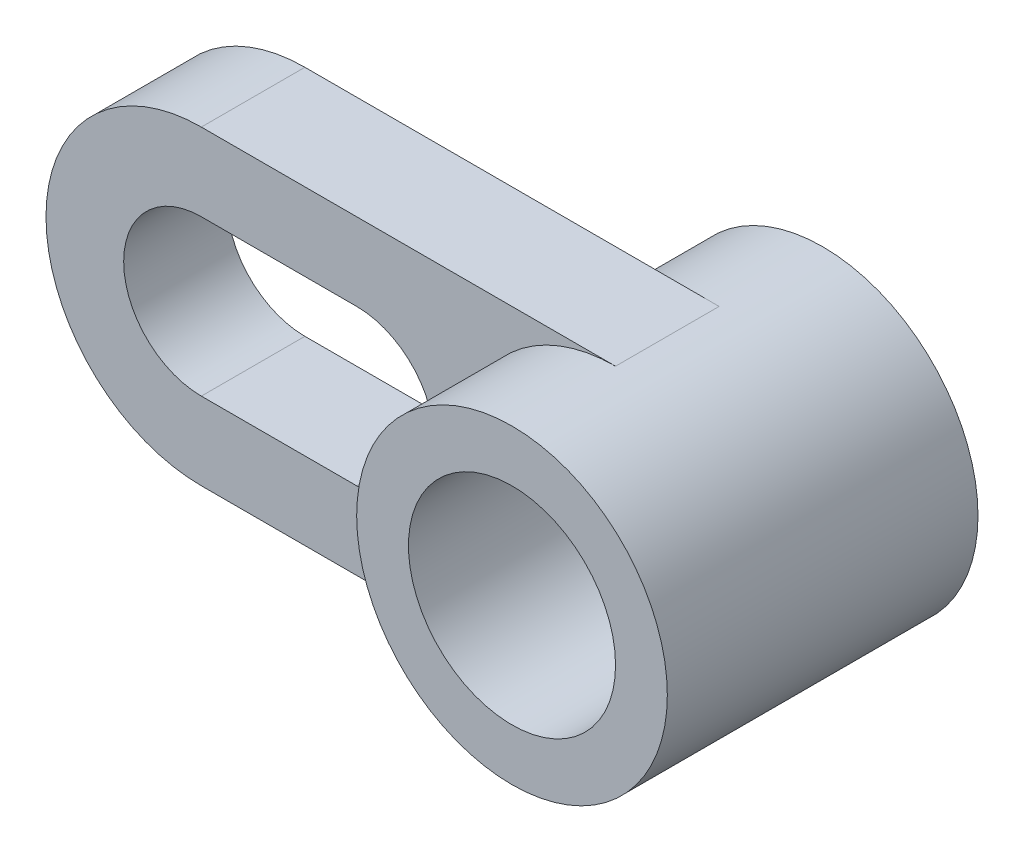
ISO-10303-21;
HEADER;
FILE_DESCRIPTION(('STEP AP214'),'2;1');
FILE_NAME('part.step','',(''),(''),'','','');
FILE_SCHEMA(('AUTOMOTIVE_DESIGN { 1 0 10303 214 1 1 1 1 }'));
ENDSEC;
DATA;
#1=APPLICATION_CONTEXT('core data for automotive mechanical design processes');
#2=APPLICATION_PROTOCOL_DEFINITION('international standard','automotive_design',2000,#1);
#3=PRODUCT_CONTEXT('',#1,'mechanical');
#4=PRODUCT('Part','Part','',(#3));
#5=PRODUCT_RELATED_PRODUCT_CATEGORY('part','',(#4));
#6=PRODUCT_DEFINITION_FORMATION('','',#4);
#7=PRODUCT_DEFINITION_CONTEXT('part definition',#1,'design');
#8=PRODUCT_DEFINITION('design','',#6,#7);
#9=PRODUCT_DEFINITION_SHAPE('','',#8);
#10=(LENGTH_UNIT() NAMED_UNIT(*) SI_UNIT(.MILLI.,.METRE.));
#11=(NAMED_UNIT(*) PLANE_ANGLE_UNIT() SI_UNIT($,.RADIAN.));
#12=(NAMED_UNIT(*) SI_UNIT($,.STERADIAN.) SOLID_ANGLE_UNIT());
#13=UNCERTAINTY_MEASURE_WITH_UNIT(LENGTH_MEASURE(1.E-05),#10,'distance_accuracy_value','');
#14=(GEOMETRIC_REPRESENTATION_CONTEXT(3) GLOBAL_UNCERTAINTY_ASSIGNED_CONTEXT((#13)) GLOBAL_UNIT_ASSIGNED_CONTEXT((#10,
#11,#12)) REPRESENTATION_CONTEXT('',''));
#15=CARTESIAN_POINT('',(0.,0.,0.));
#16=DIRECTION('',(0.,0.,1.));
#17=DIRECTION('',(1.,0.,0.));
#18=AXIS2_PLACEMENT_3D('',#15,#16,#17);
#19=CARTESIAN_POINT('',(0.,0.,-30.));
#20=DIRECTION('',(0.,0.,1.));
#21=DIRECTION('',(1.,0.,0.));
#22=AXIS2_PLACEMENT_3D('',#19,#20,#21);
#23=CYLINDRICAL_SURFACE('',#22,15.);
#24=CARTESIAN_POINT('',(0.,0.,-30.));
#25=DIRECTION('',(0.,0.,1.));
#26=DIRECTION('',(1.,0.,0.));
#27=AXIS2_PLACEMENT_3D('',#24,#25,#26);
#28=CIRCLE('',#27,15.);
#29=CARTESIAN_POINT('',(15.,0.,-30.));
#30=VERTEX_POINT('',#29);
#31=EDGE_CURVE('E11',#30,#30,#28,.T.);
#32=ORIENTED_EDGE('',*,*,#31,.T.);
#33=EDGE_LOOP('',(#32));
#34=FACE_BOUND('',#33,.T.);
#35=CARTESIAN_POINT('',(0.,0.,0.));
#36=DIRECTION('',(0.,0.,1.));
#37=DIRECTION('',(1.,0.,0.));
#38=AXIS2_PLACEMENT_3D('',#35,#36,#37);
#39=CIRCLE('',#38,15.);
#40=CARTESIAN_POINT('',(15.,0.,0.));
#41=VERTEX_POINT('',#40);
#42=EDGE_CURVE('E40',#41,#41,#39,.T.);
#43=ORIENTED_EDGE('',*,*,#42,.F.);
#44=EDGE_LOOP('',(#43));
#45=FACE_BOUND('',#44,.T.);
#46=CARTESIAN_POINT('',(0.,0.,-10.));
#47=DIRECTION('',(0.,0.,-1.));
#48=DIRECTION('',(1.,0.,0.));
#49=AXIS2_PLACEMENT_3D('',#46,#47,#48);
#50=CIRCLE('',#49,15.);
#51=CARTESIAN_POINT('',(0.,-15.,-10.));
#52=VERTEX_POINT('',#51);
#53=CARTESIAN_POINT('',(0.,15.,-10.));
#54=VERTEX_POINT('',#53);
#55=EDGE_CURVE('E51',#52,#54,#50,.T.);
#56=ORIENTED_EDGE('',*,*,#55,.F.);
#57=DIRECTION('',(0.,0.,-1.));
#58=VECTOR('',#57,1.);
#59=CARTESIAN_POINT('',(0.,-15.,-10.));
#60=LINE('',#59,#58);
#61=CARTESIAN_POINT('',(0.,-15.,-20.));
#62=VERTEX_POINT('',#61);
#63=EDGE_CURVE('E56',#52,#62,#60,.T.);
#64=ORIENTED_EDGE('',*,*,#63,.T.);
#65=CARTESIAN_POINT('',(0.,0.,-20.));
#66=DIRECTION('',(0.,0.,-1.));
#67=DIRECTION('',(1.,0.,0.));
#68=AXIS2_PLACEMENT_3D('',#65,#66,#67);
#69=CIRCLE('',#68,15.);
#70=CARTESIAN_POINT('',(0.,15.,-20.));
#71=VERTEX_POINT('',#70);
#72=EDGE_CURVE('E157',#62,#71,#69,.T.);
#73=ORIENTED_EDGE('',*,*,#72,.T.);
#74=DIRECTION('',(0.,0.,-1.));
#75=VECTOR('',#74,1.);
#76=CARTESIAN_POINT('',(0.,15.,-10.));
#77=LINE('',#76,#75);
#78=EDGE_CURVE('E162',#54,#71,#77,.T.);
#79=ORIENTED_EDGE('',*,*,#78,.F.);
#80=EDGE_LOOP('',(#56,#64,#73,#79));
#81=FACE_BOUND('',#80,.T.);
#82=ADVANCED_FACE('F37',(#34,#45,#81),#23,.T.);
#83=CARTESIAN_POINT('',(0.,0.,-30.));
#84=DIRECTION('',(0.,0.,1.));
#85=DIRECTION('',(1.,0.,0.));
#86=AXIS2_PLACEMENT_3D('',#83,#84,#85);
#87=PLANE('',#86);
#88=CARTESIAN_POINT('',(0.,0.,-30.));
#89=DIRECTION('',(0.,0.,1.));
#90=DIRECTION('',(1.,0.,0.));
#91=AXIS2_PLACEMENT_3D('',#88,#89,#90);
#92=CIRCLE('',#91,10.);
#93=CARTESIAN_POINT('',(10.,0.,-30.));
#94=VERTEX_POINT('',#93);
#95=EDGE_CURVE('E170',#94,#94,#92,.T.);
#96=ORIENTED_EDGE('',*,*,#95,.T.);
#97=EDGE_LOOP('',(#96));
#98=FACE_BOUND('',#97,.T.);
#99=ORIENTED_EDGE('',*,*,#31,.F.);
#100=EDGE_LOOP('',(#99));
#101=FACE_BOUND('',#100,.T.);
#102=ADVANCED_FACE('F181',(#98,#101),#87,.F.);
#103=CARTESIAN_POINT('',(0.,0.,0.));
#104=DIRECTION('',(0.,0.,1.));
#105=DIRECTION('',(1.,0.,0.));
#106=AXIS2_PLACEMENT_3D('',#103,#104,#105);
#107=PLANE('',#106);
#108=CARTESIAN_POINT('',(0.,0.,0.));
#109=DIRECTION('',(0.,0.,1.));
#110=DIRECTION('',(1.,0.,0.));
#111=AXIS2_PLACEMENT_3D('',#108,#109,#110);
#112=CIRCLE('',#111,10.);
#113=CARTESIAN_POINT('',(10.,0.,0.));
#114=VERTEX_POINT('',#113);
#115=EDGE_CURVE('E169',#114,#114,#112,.T.);
#116=ORIENTED_EDGE('',*,*,#115,.F.);
#117=EDGE_LOOP('',(#116));
#118=FACE_BOUND('',#117,.T.);
#119=ORIENTED_EDGE('',*,*,#42,.T.);
#120=EDGE_LOOP('',(#119));
#121=FACE_BOUND('',#120,.T.);
#122=ADVANCED_FACE('F178',(#118,#121),#107,.T.);
#123=CARTESIAN_POINT('',(0.,0.,-30.));
#124=DIRECTION('',(0.,0.,1.));
#125=DIRECTION('',(1.,0.,0.));
#126=AXIS2_PLACEMENT_3D('',#123,#124,#125);
#127=CYLINDRICAL_SURFACE('',#126,10.);
#128=ORIENTED_EDGE('',*,*,#95,.F.);
#129=EDGE_LOOP('',(#128));
#130=FACE_BOUND('',#129,.T.);
#131=ORIENTED_EDGE('',*,*,#115,.T.);
#132=EDGE_LOOP('',(#131));
#133=FACE_BOUND('',#132,.T.);
#134=ADVANCED_FACE('F176',(#130,#133),#127,.F.);
#135=CARTESIAN_POINT('',(-40.,0.,-10.));
#136=DIRECTION('',(0.,0.,1.));
#137=DIRECTION('',(1.,0.,0.));
#138=AXIS2_PLACEMENT_3D('',#135,#136,#137);
#139=PLANE('',#138);
#140=CARTESIAN_POINT('',(-40.,0.,-10.));
#141=DIRECTION('',(0.,0.,1.));
#142=DIRECTION('',(1.,0.,0.));
#143=AXIS2_PLACEMENT_3D('',#140,#141,#142);
#144=CIRCLE('',#143,15.);
#145=CARTESIAN_POINT('',(-40.,15.,-10.));
#146=VERTEX_POINT('',#145);
#147=CARTESIAN_POINT('',(-40.,-15.,-10.));
#148=VERTEX_POINT('',#147);
#149=EDGE_CURVE('E143',#146,#148,#144,.T.);
#150=ORIENTED_EDGE('',*,*,#149,.T.);
#151=DIRECTION('',(1.,0.,0.));
#152=VECTOR('',#151,1.);
#153=CARTESIAN_POINT('',(-40.,-15.,-10.));
#154=LINE('',#153,#152);
#155=EDGE_CURVE('E146',#148,#52,#154,.T.);
#156=ORIENTED_EDGE('',*,*,#155,.T.);
#157=ORIENTED_EDGE('',*,*,#55,.T.);
#158=DIRECTION('',(-1.,0.,0.));
#159=VECTOR('',#158,1.);
#160=CARTESIAN_POINT('',(-40.,15.,-10.));
#161=LINE('',#160,#159);
#162=EDGE_CURVE('E150',#54,#146,#161,.T.);
#163=ORIENTED_EDGE('',*,*,#162,.T.);
#164=EDGE_LOOP('',(#150,#156,#157,#163));
#165=FACE_BOUND('',#164,.T.);
#166=DIRECTION('',(1.,0.,0.));
#167=VECTOR('',#166,1.);
#168=CARTESIAN_POINT('',(-40.,-7.5,-10.));
#169=LINE('',#168,#167);
#170=CARTESIAN_POINT('',(-40.,-7.5,-10.));
#171=VERTEX_POINT('',#170);
#172=CARTESIAN_POINT('',(-25.,-7.5,-10.));
#173=VERTEX_POINT('',#172);
#174=EDGE_CURVE('E111',#171,#173,#169,.T.);
#175=ORIENTED_EDGE('',*,*,#174,.F.);
#176=CARTESIAN_POINT('',(-40.,0.,-10.));
#177=DIRECTION('',(0.,0.,1.));
#178=DIRECTION('',(1.,0.,0.));
#179=AXIS2_PLACEMENT_3D('',#176,#177,#178);
#180=CIRCLE('',#179,7.5);
#181=CARTESIAN_POINT('',(-40.,7.5,-10.));
#182=VERTEX_POINT('',#181);
#183=EDGE_CURVE('E101',#182,#171,#180,.T.);
#184=ORIENTED_EDGE('',*,*,#183,.F.);
#185=DIRECTION('',(-1.,0.,0.));
#186=VECTOR('',#185,1.);
#187=CARTESIAN_POINT('',(-40.,7.5,-10.));
#188=LINE('',#187,#186);
#189=CARTESIAN_POINT('',(-25.,7.5,-10.));
#190=VERTEX_POINT('',#189);
#191=EDGE_CURVE('E127',#190,#182,#188,.T.);
#192=ORIENTED_EDGE('',*,*,#191,.F.);
#193=CARTESIAN_POINT('',(-25.,0.,-10.));
#194=DIRECTION('',(0.,0.,1.));
#195=DIRECTION('',(1.,0.,0.));
#196=AXIS2_PLACEMENT_3D('',#193,#194,#195);
#197=CIRCLE('',#196,7.5);
#198=EDGE_CURVE('E125',#173,#190,#197,.T.);
#199=ORIENTED_EDGE('',*,*,#198,.F.);
#200=EDGE_LOOP('',(#175,#184,#192,#199));
#201=FACE_BOUND('',#200,.T.);
#202=ADVANCED_FACE('F123',(#165,#201),#139,.T.);
#203=CARTESIAN_POINT('',(-40.,0.,-20.));
#204=DIRECTION('',(0.,0.,1.));
#205=DIRECTION('',(1.,0.,0.));
#206=AXIS2_PLACEMENT_3D('',#203,#204,#205);
#207=PLANE('',#206);
#208=CARTESIAN_POINT('',(-40.,0.,-20.));
#209=DIRECTION('',(0.,0.,1.));
#210=DIRECTION('',(1.,0.,0.));
#211=AXIS2_PLACEMENT_3D('',#208,#209,#210);
#212=CIRCLE('',#211,15.);
#213=CARTESIAN_POINT('',(-40.,15.,-20.));
#214=VERTEX_POINT('',#213);
#215=CARTESIAN_POINT('',(-40.,-15.,-20.));
#216=VERTEX_POINT('',#215);
#217=EDGE_CURVE('E119',#214,#216,#212,.T.);
#218=ORIENTED_EDGE('',*,*,#217,.F.);
#219=DIRECTION('',(-1.,0.,0.));
#220=VECTOR('',#219,1.);
#221=CARTESIAN_POINT('',(-40.,15.,-20.));
#222=LINE('',#221,#220);
#223=EDGE_CURVE('E147',#71,#214,#222,.T.);
#224=ORIENTED_EDGE('',*,*,#223,.F.);
#225=ORIENTED_EDGE('',*,*,#72,.F.);
#226=DIRECTION('',(1.,0.,0.));
#227=VECTOR('',#226,1.);
#228=CARTESIAN_POINT('',(-40.,-15.,-20.));
#229=LINE('',#228,#227);
#230=EDGE_CURVE('E155',#216,#62,#229,.T.);
#231=ORIENTED_EDGE('',*,*,#230,.F.);
#232=EDGE_LOOP('',(#218,#224,#225,#231));
#233=FACE_BOUND('',#232,.T.);
#234=CARTESIAN_POINT('',(-40.,0.,-20.));
#235=DIRECTION('',(0.,0.,1.));
#236=DIRECTION('',(1.,0.,0.));
#237=AXIS2_PLACEMENT_3D('',#234,#235,#236);
#238=CIRCLE('',#237,7.5);
#239=CARTESIAN_POINT('',(-40.,7.5,-20.));
#240=VERTEX_POINT('',#239);
#241=CARTESIAN_POINT('',(-40.,-7.5,-20.));
#242=VERTEX_POINT('',#241);
#243=EDGE_CURVE('E131',#240,#242,#238,.T.);
#244=ORIENTED_EDGE('',*,*,#243,.T.);
#245=DIRECTION('',(1.,0.,0.));
#246=VECTOR('',#245,1.);
#247=CARTESIAN_POINT('',(-40.,-7.5,-20.));
#248=LINE('',#247,#246);
#249=CARTESIAN_POINT('',(-25.,-7.5,-20.));
#250=VERTEX_POINT('',#249);
#251=EDGE_CURVE('E118',#242,#250,#248,.T.);
#252=ORIENTED_EDGE('',*,*,#251,.T.);
#253=CARTESIAN_POINT('',(-25.,0.,-20.));
#254=DIRECTION('',(0.,0.,1.));
#255=DIRECTION('',(1.,0.,0.));
#256=AXIS2_PLACEMENT_3D('',#253,#254,#255);
#257=CIRCLE('',#256,7.5);
#258=CARTESIAN_POINT('',(-25.,7.5,-20.));
#259=VERTEX_POINT('',#258);
#260=EDGE_CURVE('E134',#250,#259,#257,.T.);
#261=ORIENTED_EDGE('',*,*,#260,.T.);
#262=DIRECTION('',(-1.,0.,0.));
#263=VECTOR('',#262,1.);
#264=CARTESIAN_POINT('',(-40.,7.5,-20.));
#265=LINE('',#264,#263);
#266=EDGE_CURVE('E112',#259,#240,#265,.T.);
#267=ORIENTED_EDGE('',*,*,#266,.T.);
#268=EDGE_LOOP('',(#244,#252,#261,#267));
#269=FACE_BOUND('',#268,.T.);
#270=ADVANCED_FACE('F204',(#233,#269),#207,.F.);
#271=CARTESIAN_POINT('',(-40.,0.,-10.));
#272=DIRECTION('',(0.,0.,-1.));
#273=DIRECTION('',(-1.,0.,0.));
#274=AXIS2_PLACEMENT_3D('',#271,#272,#273);
#275=CYLINDRICAL_SURFACE('',#274,15.);
#276=ORIENTED_EDGE('',*,*,#217,.T.);
#277=DIRECTION('',(0.,0.,-1.));
#278=VECTOR('',#277,1.);
#279=CARTESIAN_POINT('',(-40.,-15.,-10.));
#280=LINE('',#279,#278);
#281=EDGE_CURVE('E166',#148,#216,#280,.T.);
#282=ORIENTED_EDGE('',*,*,#281,.F.);
#283=ORIENTED_EDGE('',*,*,#149,.F.);
#284=DIRECTION('',(0.,0.,-1.));
#285=VECTOR('',#284,1.);
#286=CARTESIAN_POINT('',(-40.,15.,-10.));
#287=LINE('',#286,#285);
#288=EDGE_CURVE('E152',#146,#214,#287,.T.);
#289=ORIENTED_EDGE('',*,*,#288,.T.);
#290=EDGE_LOOP('',(#276,#282,#283,#289));
#291=FACE_BOUND('',#290,.T.);
#292=ADVANCED_FACE('F200',(#291),#275,.T.);
#293=CARTESIAN_POINT('',(-40.,-15.,-10.));
#294=DIRECTION('',(0.,1.,0.));
#295=DIRECTION('',(0.,0.,1.));
#296=AXIS2_PLACEMENT_3D('',#293,#294,#295);
#297=PLANE('',#296);
#298=ORIENTED_EDGE('',*,*,#230,.T.);
#299=ORIENTED_EDGE('',*,*,#63,.F.);
#300=ORIENTED_EDGE('',*,*,#155,.F.);
#301=ORIENTED_EDGE('',*,*,#281,.T.);
#302=EDGE_LOOP('',(#298,#299,#300,#301));
#303=FACE_BOUND('',#302,.T.);
#304=ADVANCED_FACE('F203',(#303),#297,.F.);
#305=CARTESIAN_POINT('',(-40.,15.,-10.));
#306=DIRECTION('',(0.,-1.,0.));
#307=DIRECTION('',(0.,0.,-1.));
#308=AXIS2_PLACEMENT_3D('',#305,#306,#307);
#309=PLANE('',#308);
#310=ORIENTED_EDGE('',*,*,#223,.T.);
#311=ORIENTED_EDGE('',*,*,#288,.F.);
#312=ORIENTED_EDGE('',*,*,#162,.F.);
#313=ORIENTED_EDGE('',*,*,#78,.T.);
#314=EDGE_LOOP('',(#310,#311,#312,#313));
#315=FACE_BOUND('',#314,.T.);
#316=ADVANCED_FACE('F208',(#315),#309,.F.);
#317=CARTESIAN_POINT('',(-40.,0.,-10.));
#318=DIRECTION('',(0.,0.,-1.));
#319=DIRECTION('',(-1.,0.,0.));
#320=AXIS2_PLACEMENT_3D('',#317,#318,#319);
#321=CYLINDRICAL_SURFACE('',#320,7.5);
#322=ORIENTED_EDGE('',*,*,#243,.F.);
#323=DIRECTION('',(0.,0.,-1.));
#324=VECTOR('',#323,1.);
#325=CARTESIAN_POINT('',(-40.,7.5,-10.));
#326=LINE('',#325,#324);
#327=EDGE_CURVE('E107',#182,#240,#326,.T.);
#328=ORIENTED_EDGE('',*,*,#327,.F.);
#329=ORIENTED_EDGE('',*,*,#183,.T.);
#330=DIRECTION('',(0.,0.,-1.));
#331=VECTOR('',#330,1.);
#332=CARTESIAN_POINT('',(-40.,-7.5,-10.));
#333=LINE('',#332,#331);
#334=EDGE_CURVE('E104',#171,#242,#333,.T.);
#335=ORIENTED_EDGE('',*,*,#334,.T.);
#336=EDGE_LOOP('',(#322,#328,#329,#335));
#337=FACE_BOUND('',#336,.T.);
#338=ADVANCED_FACE('F103',(#337),#321,.F.);
#339=CARTESIAN_POINT('',(-40.,-7.5,-10.));
#340=DIRECTION('',(0.,1.,0.));
#341=DIRECTION('',(0.,0.,1.));
#342=AXIS2_PLACEMENT_3D('',#339,#340,#341);
#343=PLANE('',#342);
#344=ORIENTED_EDGE('',*,*,#251,.F.);
#345=ORIENTED_EDGE('',*,*,#334,.F.);
#346=ORIENTED_EDGE('',*,*,#174,.T.);
#347=DIRECTION('',(0.,0.,-1.));
#348=VECTOR('',#347,1.);
#349=CARTESIAN_POINT('',(-25.,-7.5,-10.));
#350=LINE('',#349,#348);
#351=EDGE_CURVE('E120',#173,#250,#350,.T.);
#352=ORIENTED_EDGE('',*,*,#351,.T.);
#353=EDGE_LOOP('',(#344,#345,#346,#352));
#354=FACE_BOUND('',#353,.T.);
#355=ADVANCED_FACE('F115',(#354),#343,.T.);
#356=CARTESIAN_POINT('',(-25.,0.,-10.));
#357=DIRECTION('',(0.,0.,-1.));
#358=DIRECTION('',(-1.,0.,0.));
#359=AXIS2_PLACEMENT_3D('',#356,#357,#358);
#360=CYLINDRICAL_SURFACE('',#359,7.5);
#361=ORIENTED_EDGE('',*,*,#260,.F.);
#362=ORIENTED_EDGE('',*,*,#351,.F.);
#363=ORIENTED_EDGE('',*,*,#198,.T.);
#364=DIRECTION('',(0.,0.,-1.));
#365=VECTOR('',#364,1.);
#366=CARTESIAN_POINT('',(-25.,7.5,-10.));
#367=LINE('',#366,#365);
#368=EDGE_CURVE('E140',#190,#259,#367,.T.);
#369=ORIENTED_EDGE('',*,*,#368,.T.);
#370=EDGE_LOOP('',(#361,#362,#363,#369));
#371=FACE_BOUND('',#370,.T.);
#372=ADVANCED_FACE('F223',(#371),#360,.F.);
#373=CARTESIAN_POINT('',(-40.,7.5,-10.));
#374=DIRECTION('',(0.,-1.,0.));
#375=DIRECTION('',(0.,0.,-1.));
#376=AXIS2_PLACEMENT_3D('',#373,#374,#375);
#377=PLANE('',#376);
#378=ORIENTED_EDGE('',*,*,#266,.F.);
#379=ORIENTED_EDGE('',*,*,#368,.F.);
#380=ORIENTED_EDGE('',*,*,#191,.T.);
#381=ORIENTED_EDGE('',*,*,#327,.T.);
#382=EDGE_LOOP('',(#378,#379,#380,#381));
#383=FACE_BOUND('',#382,.T.);
#384=ADVANCED_FACE('F226',(#383),#377,.T.);
#385=CLOSED_SHELL('',(#82,#102,#122,#134,#202,#270,#292,#304,#316,#338,#355,#372,#384));
#386=MANIFOLD_SOLID_BREP('B2',#385);
#387=ADVANCED_BREP_SHAPE_REPRESENTATION('',(#18,#386),#14);
#388=SHAPE_DEFINITION_REPRESENTATION(#9,#387);
ENDSEC;
END-ISO-10303-21;
